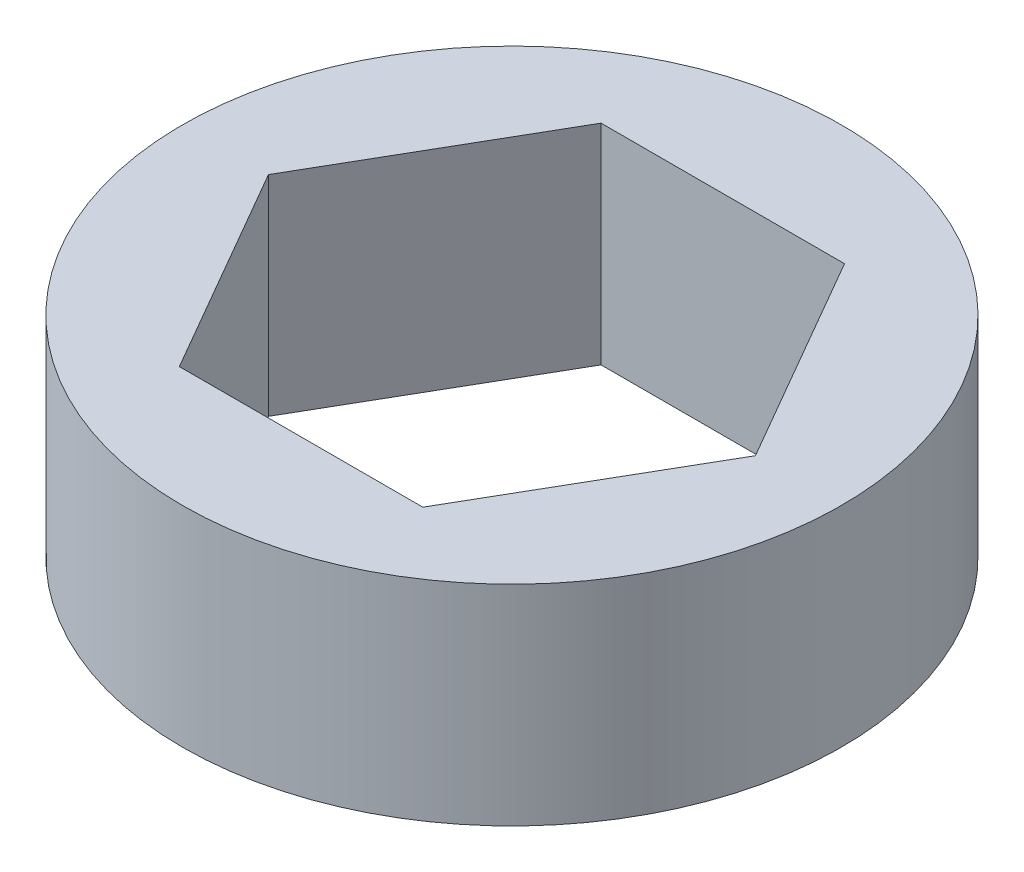
ISO-10303-21;
HEADER;
FILE_DESCRIPTION(('STEP AP214'),'2;1');
FILE_NAME('part.step','',(''),(''),'','','');
FILE_SCHEMA(('AUTOMOTIVE_DESIGN { 1 0 10303 214 1 1 1 1 }'));
ENDSEC;
DATA;
#1=APPLICATION_CONTEXT('core data for automotive mechanical design processes');
#2=APPLICATION_PROTOCOL_DEFINITION('international standard','automotive_design',2000,#1);
#3=PRODUCT_CONTEXT('',#1,'mechanical');
#4=PRODUCT('Part','Part','',(#3));
#5=PRODUCT_RELATED_PRODUCT_CATEGORY('part','',(#4));
#6=PRODUCT_DEFINITION_FORMATION('','',#4);
#7=PRODUCT_DEFINITION_CONTEXT('part definition',#1,'design');
#8=PRODUCT_DEFINITION('design','',#6,#7);
#9=PRODUCT_DEFINITION_SHAPE('','',#8);
#10=(LENGTH_UNIT() NAMED_UNIT(*) SI_UNIT(.MILLI.,.METRE.));
#11=(NAMED_UNIT(*) PLANE_ANGLE_UNIT() SI_UNIT($,.RADIAN.));
#12=(NAMED_UNIT(*) SI_UNIT($,.STERADIAN.) SOLID_ANGLE_UNIT());
#13=UNCERTAINTY_MEASURE_WITH_UNIT(LENGTH_MEASURE(1.E-05),#10,'distance_accuracy_value','');
#14=(GEOMETRIC_REPRESENTATION_CONTEXT(3) GLOBAL_UNCERTAINTY_ASSIGNED_CONTEXT((#13)) GLOBAL_UNIT_ASSIGNED_CONTEXT((#10,
#11,#12)) REPRESENTATION_CONTEXT('',''));
#15=CARTESIAN_POINT('',(0.,0.,0.));
#16=DIRECTION('',(0.,0.,1.));
#17=DIRECTION('',(1.,0.,0.));
#18=AXIS2_PLACEMENT_3D('',#15,#16,#17);
#19=CARTESIAN_POINT('',(0.,6.35,0.));
#20=DIRECTION('',(0.,1.,0.));
#21=DIRECTION('',(0.,0.,1.));
#22=AXIS2_PLACEMENT_3D('',#19,#20,#21);
#23=PLANE('',#22);
#24=CARTESIAN_POINT('',(0.,6.35,0.));
#25=DIRECTION('',(0.,1.,0.));
#26=DIRECTION('',(0.,0.,1.));
#27=AXIS2_PLACEMENT_3D('',#24,#25,#26);
#28=CIRCLE('',#27,9.9949);
#29=CARTESIAN_POINT('',(0.,6.35,9.9949));
#30=VERTEX_POINT('',#29);
#31=EDGE_CURVE('E11',#30,#30,#28,.T.);
#32=ORIENTED_EDGE('',*,*,#31,.T.);
#33=EDGE_LOOP('',(#32));
#34=FACE_BOUND('',#33,.T.);
#35=DIRECTION('',(-0.500000000000001,0.,-0.866025403784438));
#36=VECTOR('',#35,1.);
#37=CARTESIAN_POINT('',(7.38367485763918,6.35,0.));
#38=LINE('',#37,#36);
#39=CARTESIAN_POINT('',(7.38367485763918,6.35,0.));
#40=VERTEX_POINT('',#39);
#41=CARTESIAN_POINT('',(3.69183742881957,6.35,-6.39444999999998));
#42=VERTEX_POINT('',#41);
#43=EDGE_CURVE('E95',#40,#42,#38,.T.);
#44=ORIENTED_EDGE('',*,*,#43,.F.);
#45=DIRECTION('',(0.499999999999995,0.,-0.866025403784441));
#46=VECTOR('',#45,1.);
#47=CARTESIAN_POINT('',(3.69183742881966,6.35,6.39444999999993));
#48=LINE('',#47,#46);
#49=CARTESIAN_POINT('',(3.69183742881966,6.35,6.39444999999993));
#50=VERTEX_POINT('',#49);
#51=EDGE_CURVE('E87',#50,#40,#48,.T.);
#52=ORIENTED_EDGE('',*,*,#51,.F.);
#53=DIRECTION('',(1.,0.,0.));
#54=VECTOR('',#53,1.);
#55=CARTESIAN_POINT('',(-3.69183742881953,6.35,6.39445000000001));
#56=LINE('',#55,#54);
#57=CARTESIAN_POINT('',(-3.69183742881953,6.35,6.39445000000001));
#58=VERTEX_POINT('',#57);
#59=EDGE_CURVE('E115',#58,#50,#56,.T.);
#60=ORIENTED_EDGE('',*,*,#59,.F.);
#61=DIRECTION('',(0.500000000000007,0.,0.866025403784434));
#62=VECTOR('',#61,1.);
#63=CARTESIAN_POINT('',(-7.38367485763918,6.35,0.));
#64=LINE('',#63,#62);
#65=CARTESIAN_POINT('',(-7.38367485763918,6.35,0.));
#66=VERTEX_POINT('',#65);
#67=EDGE_CURVE('E113',#66,#58,#64,.T.);
#68=ORIENTED_EDGE('',*,*,#67,.F.);
#69=DIRECTION('',(-0.499999999999995,0.,0.866025403784442));
#70=VECTOR('',#69,1.);
#71=CARTESIAN_POINT('',(-3.69183742881962,6.35,-6.39444999999996));
#72=LINE('',#71,#70);
#73=CARTESIAN_POINT('',(-3.69183742881962,6.35,-6.39444999999996));
#74=VERTEX_POINT('',#73);
#75=EDGE_CURVE('E109',#74,#66,#72,.T.);
#76=ORIENTED_EDGE('',*,*,#75,.F.);
#77=DIRECTION('',(-1.,0.,0.));
#78=VECTOR('',#77,1.);
#79=CARTESIAN_POINT('',(3.69183742881957,6.35,-6.39444999999998));
#80=LINE('',#79,#78);
#81=EDGE_CURVE('E107',#42,#74,#80,.T.);
#82=ORIENTED_EDGE('',*,*,#81,.F.);
#83=EDGE_LOOP('',(#44,#52,#60,#68,#76,#82));
#84=FACE_BOUND('',#83,.T.);
#85=ADVANCED_FACE('F34',(#34,#84),#23,.T.);
#86=CARTESIAN_POINT('',(0.,0.,0.));
#87=DIRECTION('',(0.,1.,0.));
#88=DIRECTION('',(0.,0.,1.));
#89=AXIS2_PLACEMENT_3D('',#86,#87,#88);
#90=PLANE('',#89);
#91=CARTESIAN_POINT('',(0.,0.,0.));
#92=DIRECTION('',(0.,1.,0.));
#93=DIRECTION('',(0.,0.,1.));
#94=AXIS2_PLACEMENT_3D('',#91,#92,#93);
#95=CIRCLE('',#94,9.9949);
#96=CARTESIAN_POINT('',(0.,0.,9.9949));
#97=VERTEX_POINT('',#96);
#98=EDGE_CURVE('E38',#97,#97,#95,.T.);
#99=ORIENTED_EDGE('',*,*,#98,.F.);
#100=EDGE_LOOP('',(#99));
#101=FACE_BOUND('',#100,.T.);
#102=DIRECTION('',(0.499999999999995,0.,-0.866025403784441));
#103=VECTOR('',#102,1.);
#104=CARTESIAN_POINT('',(3.69183742881966,0.,6.39444999999993));
#105=LINE('',#104,#103);
#106=CARTESIAN_POINT('',(3.69183742881966,0.,6.39444999999993));
#107=VERTEX_POINT('',#106);
#108=CARTESIAN_POINT('',(7.38367485763918,0.,0.));
#109=VERTEX_POINT('',#108);
#110=EDGE_CURVE('E57',#107,#109,#105,.T.);
#111=ORIENTED_EDGE('',*,*,#110,.T.);
#112=DIRECTION('',(-0.500000000000001,0.,-0.866025403784438));
#113=VECTOR('',#112,1.);
#114=CARTESIAN_POINT('',(7.38367485763918,0.,0.));
#115=LINE('',#114,#113);
#116=CARTESIAN_POINT('',(3.69183742881957,0.,-6.39444999999998));
#117=VERTEX_POINT('',#116);
#118=EDGE_CURVE('E102',#109,#117,#115,.T.);
#119=ORIENTED_EDGE('',*,*,#118,.T.);
#120=DIRECTION('',(-1.,0.,0.));
#121=VECTOR('',#120,1.);
#122=CARTESIAN_POINT('',(3.69183742881957,0.,-6.39444999999998));
#123=LINE('',#122,#121);
#124=CARTESIAN_POINT('',(-3.69183742881962,0.,-6.39444999999996));
#125=VERTEX_POINT('',#124);
#126=EDGE_CURVE('E119',#117,#125,#123,.T.);
#127=ORIENTED_EDGE('',*,*,#126,.T.);
#128=DIRECTION('',(-0.499999999999995,0.,0.866025403784442));
#129=VECTOR('',#128,1.);
#130=CARTESIAN_POINT('',(-3.69183742881962,0.,-6.39444999999996));
#131=LINE('',#130,#129);
#132=CARTESIAN_POINT('',(-7.38367485763918,0.,0.));
#133=VERTEX_POINT('',#132);
#134=EDGE_CURVE('E122',#125,#133,#131,.T.);
#135=ORIENTED_EDGE('',*,*,#134,.T.);
#136=DIRECTION('',(0.500000000000007,0.,0.866025403784434));
#137=VECTOR('',#136,1.);
#138=CARTESIAN_POINT('',(-7.38367485763918,0.,0.));
#139=LINE('',#138,#137);
#140=CARTESIAN_POINT('',(-3.69183742881953,0.,6.39445000000001));
#141=VERTEX_POINT('',#140);
#142=EDGE_CURVE('E125',#133,#141,#139,.T.);
#143=ORIENTED_EDGE('',*,*,#142,.T.);
#144=DIRECTION('',(1.,0.,0.));
#145=VECTOR('',#144,1.);
#146=CARTESIAN_POINT('',(-3.69183742881953,0.,6.39445000000001));
#147=LINE('',#146,#145);
#148=EDGE_CURVE('E96',#141,#107,#147,.T.);
#149=ORIENTED_EDGE('',*,*,#148,.T.);
#150=EDGE_LOOP('',(#111,#119,#127,#135,#143,#149));
#151=FACE_BOUND('',#150,.T.);
#152=ADVANCED_FACE('F142',(#101,#151),#90,.F.);
#153=CARTESIAN_POINT('',(0.,6.35,0.));
#154=DIRECTION('',(0.,-1.,0.));
#155=DIRECTION('',(0.,0.,-1.));
#156=AXIS2_PLACEMENT_3D('',#153,#154,#155);
#157=CYLINDRICAL_SURFACE('',#156,9.9949);
#158=ORIENTED_EDGE('',*,*,#31,.F.);
#159=EDGE_LOOP('',(#158));
#160=FACE_BOUND('',#159,.T.);
#161=ORIENTED_EDGE('',*,*,#98,.T.);
#162=EDGE_LOOP('',(#161));
#163=FACE_BOUND('',#162,.T.);
#164=ADVANCED_FACE('F36',(#160,#163),#157,.T.);
#165=CARTESIAN_POINT('',(3.69183742881966,6.35,6.39444999999993));
#166=DIRECTION('',(-0.866025403784441,0.,-0.499999999999995));
#167=DIRECTION('',(-0.499999999999995,0.,0.866025403784441));
#168=AXIS2_PLACEMENT_3D('',#165,#166,#167);
#169=PLANE('',#168);
#170=ORIENTED_EDGE('',*,*,#110,.F.);
#171=DIRECTION('',(0.,-1.,0.));
#172=VECTOR('',#171,1.);
#173=CARTESIAN_POINT('',(3.69183742881966,6.35,6.39444999999993));
#174=LINE('',#173,#172);
#175=EDGE_CURVE('E91',#50,#107,#174,.T.);
#176=ORIENTED_EDGE('',*,*,#175,.F.);
#177=ORIENTED_EDGE('',*,*,#51,.T.);
#178=DIRECTION('',(0.,-1.,0.));
#179=VECTOR('',#178,1.);
#180=CARTESIAN_POINT('',(7.38367485763918,6.35,0.));
#181=LINE('',#180,#179);
#182=EDGE_CURVE('E90',#40,#109,#181,.T.);
#183=ORIENTED_EDGE('',*,*,#182,.T.);
#184=EDGE_LOOP('',(#170,#176,#177,#183));
#185=FACE_BOUND('',#184,.T.);
#186=ADVANCED_FACE('F89',(#185),#169,.T.);
#187=CARTESIAN_POINT('',(7.38367485763918,6.35,0.));
#188=DIRECTION('',(-0.866025403784438,0.,0.500000000000001));
#189=DIRECTION('',(0.500000000000001,0.,0.866025403784438));
#190=AXIS2_PLACEMENT_3D('',#187,#188,#189);
#191=PLANE('',#190);
#192=ORIENTED_EDGE('',*,*,#118,.F.);
#193=ORIENTED_EDGE('',*,*,#182,.F.);
#194=ORIENTED_EDGE('',*,*,#43,.T.);
#195=DIRECTION('',(0.,-1.,0.));
#196=VECTOR('',#195,1.);
#197=CARTESIAN_POINT('',(3.69183742881957,6.35,-6.39444999999998));
#198=LINE('',#197,#196);
#199=EDGE_CURVE('E103',#42,#117,#198,.T.);
#200=ORIENTED_EDGE('',*,*,#199,.T.);
#201=EDGE_LOOP('',(#192,#193,#194,#200));
#202=FACE_BOUND('',#201,.T.);
#203=ADVANCED_FACE('F99',(#202),#191,.T.);
#204=CARTESIAN_POINT('',(3.69183742881957,6.35,-6.39444999999998));
#205=DIRECTION('',(0.,0.,1.));
#206=DIRECTION('',(1.,0.,0.));
#207=AXIS2_PLACEMENT_3D('',#204,#205,#206);
#208=PLANE('',#207);
#209=ORIENTED_EDGE('',*,*,#126,.F.);
#210=ORIENTED_EDGE('',*,*,#199,.F.);
#211=ORIENTED_EDGE('',*,*,#81,.T.);
#212=DIRECTION('',(0.,-1.,0.));
#213=VECTOR('',#212,1.);
#214=CARTESIAN_POINT('',(-3.69183742881962,6.35,-6.39444999999996));
#215=LINE('',#214,#213);
#216=EDGE_CURVE('E134',#74,#125,#215,.T.);
#217=ORIENTED_EDGE('',*,*,#216,.T.);
#218=EDGE_LOOP('',(#209,#210,#211,#217));
#219=FACE_BOUND('',#218,.T.);
#220=ADVANCED_FACE('F138',(#219),#208,.T.);
#221=CARTESIAN_POINT('',(-3.69183742881962,6.35,-6.39444999999996));
#222=DIRECTION('',(0.866025403784442,0.,0.499999999999995));
#223=DIRECTION('',(0.499999999999995,0.,-0.866025403784442));
#224=AXIS2_PLACEMENT_3D('',#221,#222,#223);
#225=PLANE('',#224);
#226=ORIENTED_EDGE('',*,*,#134,.F.);
#227=ORIENTED_EDGE('',*,*,#216,.F.);
#228=ORIENTED_EDGE('',*,*,#75,.T.);
#229=DIRECTION('',(0.,-1.,0.));
#230=VECTOR('',#229,1.);
#231=CARTESIAN_POINT('',(-7.38367485763918,6.35,0.));
#232=LINE('',#231,#230);
#233=EDGE_CURVE('E132',#66,#133,#232,.T.);
#234=ORIENTED_EDGE('',*,*,#233,.T.);
#235=EDGE_LOOP('',(#226,#227,#228,#234));
#236=FACE_BOUND('',#235,.T.);
#237=ADVANCED_FACE('F150',(#236),#225,.T.);
#238=CARTESIAN_POINT('',(-7.38367485763918,6.35,0.));
#239=DIRECTION('',(0.866025403784435,0.,-0.500000000000007));
#240=DIRECTION('',(-0.500000000000007,0.,-0.866025403784435));
#241=AXIS2_PLACEMENT_3D('',#238,#239,#240);
#242=PLANE('',#241);
#243=ORIENTED_EDGE('',*,*,#142,.F.);
#244=ORIENTED_EDGE('',*,*,#233,.F.);
#245=ORIENTED_EDGE('',*,*,#67,.T.);
#246=DIRECTION('',(0.,-1.,0.));
#247=VECTOR('',#246,1.);
#248=CARTESIAN_POINT('',(-3.69183742881953,6.35,6.39445000000001));
#249=LINE('',#248,#247);
#250=EDGE_CURVE('E49',#58,#141,#249,.T.);
#251=ORIENTED_EDGE('',*,*,#250,.T.);
#252=EDGE_LOOP('',(#243,#244,#245,#251));
#253=FACE_BOUND('',#252,.T.);
#254=ADVANCED_FACE('F148',(#253),#242,.T.);
#255=CARTESIAN_POINT('',(-3.69183742881953,6.35,6.39445000000001));
#256=DIRECTION('',(0.,0.,-1.));
#257=DIRECTION('',(-1.,0.,0.));
#258=AXIS2_PLACEMENT_3D('',#255,#256,#257);
#259=PLANE('',#258);
#260=ORIENTED_EDGE('',*,*,#148,.F.);
#261=ORIENTED_EDGE('',*,*,#250,.F.);
#262=ORIENTED_EDGE('',*,*,#59,.T.);
#263=ORIENTED_EDGE('',*,*,#175,.T.);
#264=EDGE_LOOP('',(#260,#261,#262,#263));
#265=FACE_BOUND('',#264,.T.);
#266=ADVANCED_FACE('F144',(#265),#259,.T.);
#267=CLOSED_SHELL('',(#85,#152,#164,#186,#203,#220,#237,#254,#266));
#268=MANIFOLD_SOLID_BREP('B2',#267);
#269=ADVANCED_BREP_SHAPE_REPRESENTATION('',(#18,#268),#14);
#270=SHAPE_DEFINITION_REPRESENTATION(#9,#269);
ENDSEC;
END-ISO-10303-21;
